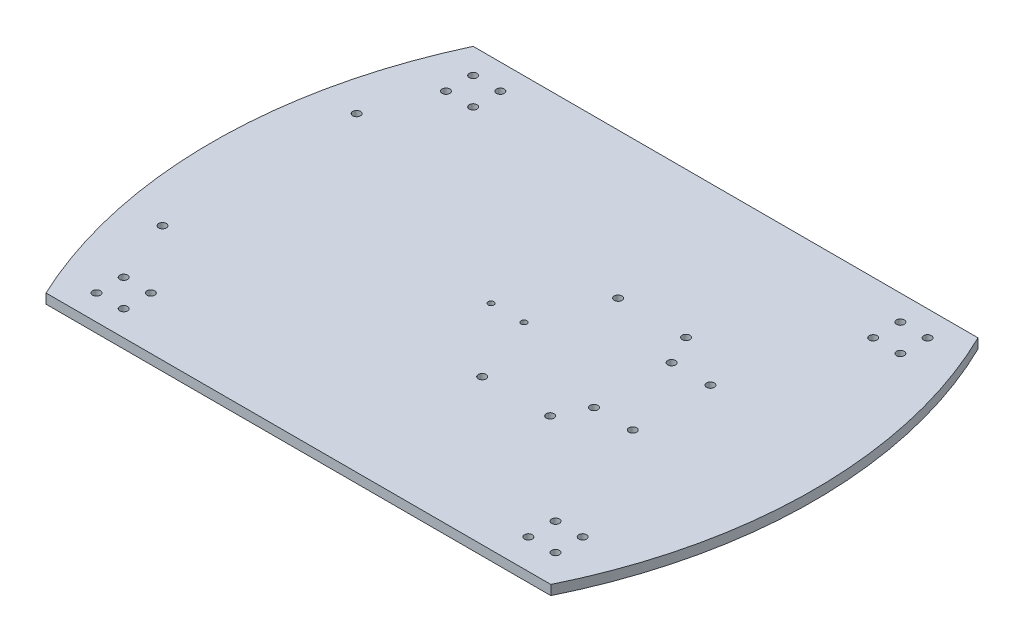
ISO-10303-21;
HEADER;
FILE_DESCRIPTION(('STEP AP214'),'2;1');
FILE_NAME('part.step','',(''),(''),'','','');
FILE_SCHEMA(('AUTOMOTIVE_DESIGN { 1 0 10303 214 1 1 1 1 }'));
ENDSEC;
DATA;
#1=APPLICATION_CONTEXT('core data for automotive mechanical design processes');
#2=APPLICATION_PROTOCOL_DEFINITION('international standard','automotive_design',2000,#1);
#3=PRODUCT_CONTEXT('',#1,'mechanical');
#4=PRODUCT('Part','Part','',(#3));
#5=PRODUCT_RELATED_PRODUCT_CATEGORY('part','',(#4));
#6=PRODUCT_DEFINITION_FORMATION('','',#4);
#7=PRODUCT_DEFINITION_CONTEXT('part definition',#1,'design');
#8=PRODUCT_DEFINITION('design','',#6,#7);
#9=PRODUCT_DEFINITION_SHAPE('','',#8);
#10=(LENGTH_UNIT() NAMED_UNIT(*) SI_UNIT(.MILLI.,.METRE.));
#11=(NAMED_UNIT(*) PLANE_ANGLE_UNIT() SI_UNIT($,.RADIAN.));
#12=(NAMED_UNIT(*) SI_UNIT($,.STERADIAN.) SOLID_ANGLE_UNIT());
#13=UNCERTAINTY_MEASURE_WITH_UNIT(LENGTH_MEASURE(1.E-05),#10,'distance_accuracy_value','');
#14=(GEOMETRIC_REPRESENTATION_CONTEXT(3) GLOBAL_UNCERTAINTY_ASSIGNED_CONTEXT((#13)) GLOBAL_UNIT_ASSIGNED_CONTEXT((#10,
#11,#12)) REPRESENTATION_CONTEXT('',''));
#15=CARTESIAN_POINT('',(0.,0.,0.));
#16=DIRECTION('',(0.,0.,1.));
#17=DIRECTION('',(1.,0.,0.));
#18=AXIS2_PLACEMENT_3D('',#15,#16,#17);
#19=CARTESIAN_POINT('',(0.,5.,-145.));
#20=DIRECTION('',(0.,0.,-1.));
#21=DIRECTION('',(-1.,0.,0.));
#22=AXIS2_PLACEMENT_3D('',#19,#20,#21);
#23=PLANE('',#22);
#24=DIRECTION('',(1.,0.,0.));
#25=VECTOR('',#24,1.);
#26=CARTESIAN_POINT('',(0.,0.,-145.));
#27=LINE('',#26,#25);
#28=CARTESIAN_POINT('',(-131.385271198948,0.,-145.));
#29=VERTEX_POINT('',#28);
#30=CARTESIAN_POINT('',(128.614728801052,0.,-145.));
#31=VERTEX_POINT('',#30);
#32=EDGE_CURVE('E133',#29,#31,#27,.T.);
#33=ORIENTED_EDGE('',*,*,#32,.F.);
#34=DIRECTION('',(0.,-1.,0.));
#35=VECTOR('',#34,1.);
#36=CARTESIAN_POINT('',(-131.385271198948,5.,-145.));
#37=LINE('',#36,#35);
#38=CARTESIAN_POINT('',(-131.385271198948,5.,-145.));
#39=VERTEX_POINT('',#38);
#40=EDGE_CURVE('E11',#39,#29,#37,.T.);
#41=ORIENTED_EDGE('',*,*,#40,.F.);
#42=DIRECTION('',(1.,0.,0.));
#43=VECTOR('',#42,1.);
#44=CARTESIAN_POINT('',(0.,5.,-145.));
#45=LINE('',#44,#43);
#46=CARTESIAN_POINT('',(128.614728801052,5.,-145.));
#47=VERTEX_POINT('',#46);
#48=EDGE_CURVE('E92',#39,#47,#45,.T.);
#49=ORIENTED_EDGE('',*,*,#48,.T.);
#50=DIRECTION('',(0.,-1.,0.));
#51=VECTOR('',#50,1.);
#52=CARTESIAN_POINT('',(128.614728801052,5.,-145.));
#53=LINE('',#52,#51);
#54=EDGE_CURVE('E53',#47,#31,#53,.T.);
#55=ORIENTED_EDGE('',*,*,#54,.T.);
#56=EDGE_LOOP('',(#33,#41,#49,#55));
#57=FACE_BOUND('',#56,.T.);
#58=ADVANCED_FACE('F36',(#57),#23,.T.);
#59=CARTESIAN_POINT('',(103.309394832352,5.,-35.));
#60=DIRECTION('',(0.,-1.,0.));
#61=DIRECTION('',(0.,0.,-1.));
#62=AXIS2_PLACEMENT_3D('',#59,#60,#61);
#63=CYLINDRICAL_SURFACE('',#62,259.194109237736);
#64=CARTESIAN_POINT('',(103.309394832352,0.,-35.));
#65=DIRECTION('',(0.,1.,0.));
#66=DIRECTION('',(0.,0.,1.));
#67=AXIS2_PLACEMENT_3D('',#64,#65,#66);
#68=CIRCLE('',#67,259.194109237736);
#69=CARTESIAN_POINT('',(-131.385271198948,0.,75.));
#70=VERTEX_POINT('',#69);
#71=EDGE_CURVE('E97',#29,#70,#68,.T.);
#72=ORIENTED_EDGE('',*,*,#71,.T.);
#73=DIRECTION('',(0.,-1.,0.));
#74=VECTOR('',#73,1.);
#75=CARTESIAN_POINT('',(-131.385271198948,5.,75.));
#76=LINE('',#75,#74);
#77=CARTESIAN_POINT('',(-131.385271198948,5.,75.));
#78=VERTEX_POINT('',#77);
#79=EDGE_CURVE('E45',#78,#70,#76,.T.);
#80=ORIENTED_EDGE('',*,*,#79,.F.);
#81=CARTESIAN_POINT('',(103.309394832352,5.,-35.));
#82=DIRECTION('',(0.,1.,0.));
#83=DIRECTION('',(0.,0.,1.));
#84=AXIS2_PLACEMENT_3D('',#81,#82,#83);
#85=CIRCLE('',#84,259.194109237736);
#86=EDGE_CURVE('E87',#39,#78,#85,.T.);
#87=ORIENTED_EDGE('',*,*,#86,.F.);
#88=ORIENTED_EDGE('',*,*,#40,.T.);
#89=EDGE_LOOP('',(#72,#80,#87,#88));
#90=FACE_BOUND('',#89,.T.);
#91=ADVANCED_FACE('F95',(#90),#63,.T.);
#92=CARTESIAN_POINT('',(0.,5.,75.));
#93=DIRECTION('',(0.,0.,-1.));
#94=DIRECTION('',(-1.,0.,0.));
#95=AXIS2_PLACEMENT_3D('',#92,#93,#94);
#96=PLANE('',#95);
#97=DIRECTION('',(1.,0.,0.));
#98=VECTOR('',#97,1.);
#99=CARTESIAN_POINT('',(0.,0.,75.));
#100=LINE('',#99,#98);
#101=CARTESIAN_POINT('',(128.614728801052,0.,75.));
#102=VERTEX_POINT('',#101);
#103=EDGE_CURVE('E130',#70,#102,#100,.T.);
#104=ORIENTED_EDGE('',*,*,#103,.T.);
#105=DIRECTION('',(0.,-1.,0.));
#106=VECTOR('',#105,1.);
#107=CARTESIAN_POINT('',(128.614728801052,5.,75.));
#108=LINE('',#107,#106);
#109=CARTESIAN_POINT('',(128.614728801052,5.,75.));
#110=VERTEX_POINT('',#109);
#111=EDGE_CURVE('E67',#110,#102,#108,.T.);
#112=ORIENTED_EDGE('',*,*,#111,.F.);
#113=DIRECTION('',(1.,0.,0.));
#114=VECTOR('',#113,1.);
#115=CARTESIAN_POINT('',(0.,5.,75.));
#116=LINE('',#115,#114);
#117=EDGE_CURVE('E79',#78,#110,#116,.T.);
#118=ORIENTED_EDGE('',*,*,#117,.F.);
#119=ORIENTED_EDGE('',*,*,#79,.T.);
#120=EDGE_LOOP('',(#104,#112,#118,#119));
#121=FACE_BOUND('',#120,.T.);
#122=ADVANCED_FACE('F81',(#121),#96,.F.);
#123=CARTESIAN_POINT('',(101.614728801052,5.,-132.));
#124=DIRECTION('',(0.,-1.,0.));
#125=DIRECTION('',(0.,0.,-1.));
#126=AXIS2_PLACEMENT_3D('',#123,#124,#125);
#127=CYLINDRICAL_SURFACE('',#126,2.);
#128=CARTESIAN_POINT('',(101.614728801052,5.,-132.));
#129=DIRECTION('',(0.,1.,0.));
#130=DIRECTION('',(0.,0.,1.));
#131=AXIS2_PLACEMENT_3D('',#128,#129,#130);
#132=CIRCLE('',#131,2.);
#133=CARTESIAN_POINT('',(101.614728801052,5.,-130.));
#134=VERTEX_POINT('',#133);
#135=EDGE_CURVE('E197',#134,#134,#132,.T.);
#136=ORIENTED_EDGE('',*,*,#135,.T.);
#137=EDGE_LOOP('',(#136));
#138=FACE_BOUND('',#137,.T.);
#139=CARTESIAN_POINT('',(101.614728801052,0.,-132.));
#140=DIRECTION('',(0.,1.,0.));
#141=DIRECTION('',(0.,0.,1.));
#142=AXIS2_PLACEMENT_3D('',#139,#140,#141);
#143=CIRCLE('',#142,2.);
#144=CARTESIAN_POINT('',(101.614728801052,0.,-130.));
#145=VERTEX_POINT('',#144);
#146=EDGE_CURVE('E106',#145,#145,#143,.T.);
#147=ORIENTED_EDGE('',*,*,#146,.F.);
#148=EDGE_LOOP('',(#147));
#149=FACE_BOUND('',#148,.T.);
#150=ADVANCED_FACE('F736',(#138,#149),#127,.F.);
#151=CARTESIAN_POINT('',(101.614728801052,5.,59.5855518026836));
#152=DIRECTION('',(0.,-1.,0.));
#153=DIRECTION('',(0.,0.,-1.));
#154=AXIS2_PLACEMENT_3D('',#151,#152,#153);
#155=CYLINDRICAL_SURFACE('',#154,2.);
#156=CARTESIAN_POINT('',(101.614728801052,5.,59.5855518026836));
#157=DIRECTION('',(0.,1.,0.));
#158=DIRECTION('',(0.,0.,1.));
#159=AXIS2_PLACEMENT_3D('',#156,#157,#158);
#160=CIRCLE('',#159,2.);
#161=CARTESIAN_POINT('',(101.614728801052,5.,61.5855518026836));
#162=VERTEX_POINT('',#161);
#163=EDGE_CURVE('E200',#162,#162,#160,.T.);
#164=ORIENTED_EDGE('',*,*,#163,.T.);
#165=EDGE_LOOP('',(#164));
#166=FACE_BOUND('',#165,.T.);
#167=CARTESIAN_POINT('',(101.614728801052,0.,59.5855518026836));
#168=DIRECTION('',(0.,1.,0.));
#169=DIRECTION('',(0.,0.,1.));
#170=AXIS2_PLACEMENT_3D('',#167,#168,#169);
#171=CIRCLE('',#170,2.);
#172=CARTESIAN_POINT('',(101.614728801052,0.,61.5855518026836));
#173=VERTEX_POINT('',#172);
#174=EDGE_CURVE('E109',#173,#173,#171,.T.);
#175=ORIENTED_EDGE('',*,*,#174,.F.);
#176=EDGE_LOOP('',(#175));
#177=FACE_BOUND('',#176,.T.);
#178=ADVANCED_FACE('F727',(#166,#177),#155,.F.);
#179=CARTESIAN_POINT('',(-118.385271198948,5.,62.));
#180=DIRECTION('',(0.,-1.,0.));
#181=DIRECTION('',(0.,0.,-1.));
#182=AXIS2_PLACEMENT_3D('',#179,#180,#181);
#183=CYLINDRICAL_SURFACE('',#182,2.);
#184=CARTESIAN_POINT('',(-118.385271198948,5.,62.));
#185=DIRECTION('',(0.,1.,0.));
#186=DIRECTION('',(0.,0.,1.));
#187=AXIS2_PLACEMENT_3D('',#184,#185,#186);
#188=CIRCLE('',#187,2.);
#189=CARTESIAN_POINT('',(-118.385271198948,5.,64.));
#190=VERTEX_POINT('',#189);
#191=EDGE_CURVE('E203',#190,#190,#188,.T.);
#192=ORIENTED_EDGE('',*,*,#191,.T.);
#193=EDGE_LOOP('',(#192));
#194=FACE_BOUND('',#193,.T.);
#195=CARTESIAN_POINT('',(-118.385271198948,0.,62.));
#196=DIRECTION('',(0.,1.,0.));
#197=DIRECTION('',(0.,0.,1.));
#198=AXIS2_PLACEMENT_3D('',#195,#196,#197);
#199=CIRCLE('',#198,2.);
#200=CARTESIAN_POINT('',(-118.385271198948,0.,64.));
#201=VERTEX_POINT('',#200);
#202=EDGE_CURVE('E112',#201,#201,#199,.T.);
#203=ORIENTED_EDGE('',*,*,#202,.F.);
#204=EDGE_LOOP('',(#203));
#205=FACE_BOUND('',#204,.T.);
#206=ADVANCED_FACE('F718',(#194,#205),#183,.F.);
#207=CARTESIAN_POINT('',(-12.1932815432223,5.,-35.));
#208=DIRECTION('',(0.,-1.,0.));
#209=DIRECTION('',(0.,0.,-1.));
#210=AXIS2_PLACEMENT_3D('',#207,#208,#209);
#211=CYLINDRICAL_SURFACE('',#210,1.5);
#212=CARTESIAN_POINT('',(-12.1932815432223,5.,-35.));
#213=DIRECTION('',(0.,1.,0.));
#214=DIRECTION('',(0.,0.,1.));
#215=AXIS2_PLACEMENT_3D('',#212,#213,#214);
#216=CIRCLE('',#215,1.5);
#217=CARTESIAN_POINT('',(-12.1932815432223,5.,-33.5));
#218=VERTEX_POINT('',#217);
#219=EDGE_CURVE('E206',#218,#218,#216,.T.);
#220=ORIENTED_EDGE('',*,*,#219,.T.);
#221=EDGE_LOOP('',(#220));
#222=FACE_BOUND('',#221,.T.);
#223=CARTESIAN_POINT('',(-12.1932815432223,0.,-35.));
#224=DIRECTION('',(0.,1.,0.));
#225=DIRECTION('',(0.,0.,1.));
#226=AXIS2_PLACEMENT_3D('',#223,#224,#225);
#227=CIRCLE('',#226,1.5);
#228=CARTESIAN_POINT('',(-12.1932815432223,0.,-33.5));
#229=VERTEX_POINT('',#228);
#230=EDGE_CURVE('E115',#229,#229,#227,.T.);
#231=ORIENTED_EDGE('',*,*,#230,.F.);
#232=EDGE_LOOP('',(#231));
#233=FACE_BOUND('',#232,.T.);
#234=ADVANCED_FACE('F709',(#222,#233),#211,.F.);
#235=CARTESIAN_POINT('',(18.2562657607656,5.,0.));
#236=DIRECTION('',(0.,-1.,0.));
#237=DIRECTION('',(0.,0.,-1.));
#238=AXIS2_PLACEMENT_3D('',#235,#236,#237);
#239=CYLINDRICAL_SURFACE('',#238,2.);
#240=CARTESIAN_POINT('',(18.2562657607656,5.,0.));
#241=DIRECTION('',(0.,1.,0.));
#242=DIRECTION('',(0.,0.,1.));
#243=AXIS2_PLACEMENT_3D('',#240,#241,#242);
#244=CIRCLE('',#243,2.);
#245=CARTESIAN_POINT('',(18.2562657607656,5.,2.00000000000001));
#246=VERTEX_POINT('',#245);
#247=EDGE_CURVE('E209',#246,#246,#244,.T.);
#248=ORIENTED_EDGE('',*,*,#247,.T.);
#249=EDGE_LOOP('',(#248));
#250=FACE_BOUND('',#249,.T.);
#251=CARTESIAN_POINT('',(18.2562657607656,0.,0.));
#252=DIRECTION('',(0.,1.,0.));
#253=DIRECTION('',(0.,0.,1.));
#254=AXIS2_PLACEMENT_3D('',#251,#252,#253);
#255=CIRCLE('',#254,2.);
#256=CARTESIAN_POINT('',(18.2562657607656,0.,2.00000000000001));
#257=VERTEX_POINT('',#256);
#258=EDGE_CURVE('E118',#257,#257,#255,.T.);
#259=ORIENTED_EDGE('',*,*,#258,.F.);
#260=EDGE_LOOP('',(#259));
#261=FACE_BOUND('',#260,.T.);
#262=ADVANCED_FACE('F700',(#250,#261),#239,.F.);
#263=CARTESIAN_POINT('',(60.8158963903236,5.,-15.));
#264=DIRECTION('',(0.,-1.,0.));
#265=DIRECTION('',(0.,0.,-1.));
#266=AXIS2_PLACEMENT_3D('',#263,#264,#265);
#267=CYLINDRICAL_SURFACE('',#266,2.);
#268=CARTESIAN_POINT('',(60.8158963903236,5.,-15.));
#269=DIRECTION('',(0.,1.,0.));
#270=DIRECTION('',(0.,0.,1.));
#271=AXIS2_PLACEMENT_3D('',#268,#269,#270);
#272=CIRCLE('',#271,2.);
#273=CARTESIAN_POINT('',(60.8158963903236,5.,-13.));
#274=VERTEX_POINT('',#273);
#275=EDGE_CURVE('E212',#274,#274,#272,.T.);
#276=ORIENTED_EDGE('',*,*,#275,.T.);
#277=EDGE_LOOP('',(#276));
#278=FACE_BOUND('',#277,.T.);
#279=CARTESIAN_POINT('',(60.8158963903236,0.,-15.));
#280=DIRECTION('',(0.,1.,0.));
#281=DIRECTION('',(0.,0.,1.));
#282=AXIS2_PLACEMENT_3D('',#279,#280,#281);
#283=CIRCLE('',#282,2.);
#284=CARTESIAN_POINT('',(60.8158963903236,0.,-13.));
#285=VERTEX_POINT('',#284);
#286=EDGE_CURVE('E121',#285,#285,#283,.T.);
#287=ORIENTED_EDGE('',*,*,#286,.F.);
#288=EDGE_LOOP('',(#287));
#289=FACE_BOUND('',#288,.T.);
#290=ADVANCED_FACE('F691',(#278,#289),#267,.F.);
#291=CARTESIAN_POINT('',(4.80671845677773,5.,-35.));
#292=DIRECTION('',(0.,-1.,0.));
#293=DIRECTION('',(0.,0.,-1.));
#294=AXIS2_PLACEMENT_3D('',#291,#292,#293);
#295=CYLINDRICAL_SURFACE('',#294,1.5);
#296=CARTESIAN_POINT('',(4.80671845677773,5.,-35.));
#297=DIRECTION('',(0.,1.,0.));
#298=DIRECTION('',(0.,0.,1.));
#299=AXIS2_PLACEMENT_3D('',#296,#297,#298);
#300=CIRCLE('',#299,1.5);
#301=CARTESIAN_POINT('',(4.80671845677773,5.,-33.5));
#302=VERTEX_POINT('',#301);
#303=EDGE_CURVE('E215',#302,#302,#300,.T.);
#304=ORIENTED_EDGE('',*,*,#303,.T.);
#305=EDGE_LOOP('',(#304));
#306=FACE_BOUND('',#305,.T.);
#307=CARTESIAN_POINT('',(4.80671845677773,0.,-35.));
#308=DIRECTION('',(0.,1.,0.));
#309=DIRECTION('',(0.,0.,1.));
#310=AXIS2_PLACEMENT_3D('',#307,#308,#309);
#311=CIRCLE('',#310,1.5);
#312=CARTESIAN_POINT('',(4.80671845677773,0.,-33.5));
#313=VERTEX_POINT('',#312);
#314=EDGE_CURVE('E124',#313,#313,#311,.T.);
#315=ORIENTED_EDGE('',*,*,#314,.F.);
#316=EDGE_LOOP('',(#315));
#317=FACE_BOUND('',#316,.T.);
#318=ADVANCED_FACE('F683',(#306,#317),#295,.F.);
#319=CARTESIAN_POINT('',(-95.8847144053844,5.,-35.));
#320=DIRECTION('',(0.,-1.,0.));
#321=DIRECTION('',(0.,0.,-1.));
#322=AXIS2_PLACEMENT_3D('',#319,#320,#321);
#323=CYLINDRICAL_SURFACE('',#322,250.);
#324=CARTESIAN_POINT('',(-95.8847144053844,0.,-35.));
#325=DIRECTION('',(0.,1.,0.));
#326=DIRECTION('',(0.,0.,1.));
#327=AXIS2_PLACEMENT_3D('',#324,#325,#326);
#328=CIRCLE('',#327,250.);
#329=EDGE_CURVE('E127',#31,#102,#328,.F.);
#330=ORIENTED_EDGE('',*,*,#329,.F.);
#331=ORIENTED_EDGE('',*,*,#54,.F.);
#332=CARTESIAN_POINT('',(-95.8847144053844,5.,-35.));
#333=DIRECTION('',(0.,1.,0.));
#334=DIRECTION('',(0.,0.,1.));
#335=AXIS2_PLACEMENT_3D('',#332,#333,#334);
#336=CIRCLE('',#335,250.);
#337=EDGE_CURVE('E86',#47,#110,#336,.F.);
#338=ORIENTED_EDGE('',*,*,#337,.T.);
#339=ORIENTED_EDGE('',*,*,#111,.T.);
#340=EDGE_LOOP('',(#330,#331,#338,#339));
#341=FACE_BOUND('',#340,.T.);
#342=ADVANCED_FACE('F329',(#341),#323,.T.);
#343=CARTESIAN_POINT('',(-131.385271198948,5.,-85.));
#344=DIRECTION('',(0.,-1.,0.));
#345=DIRECTION('',(0.,0.,-1.));
#346=AXIS2_PLACEMENT_3D('',#343,#344,#345);
#347=CYLINDRICAL_SURFACE('',#346,2.);
#348=CARTESIAN_POINT('',(-131.385271198948,5.,-85.));
#349=DIRECTION('',(0.,1.,0.));
#350=DIRECTION('',(0.,0.,1.));
#351=AXIS2_PLACEMENT_3D('',#348,#349,#350);
#352=CIRCLE('',#351,2.);
#353=CARTESIAN_POINT('',(-131.385271198948,5.,-83.));
#354=VERTEX_POINT('',#353);
#355=EDGE_CURVE('E220',#354,#354,#352,.T.);
#356=ORIENTED_EDGE('',*,*,#355,.T.);
#357=EDGE_LOOP('',(#356));
#358=FACE_BOUND('',#357,.T.);
#359=CARTESIAN_POINT('',(-131.385271198948,0.,-85.));
#360=DIRECTION('',(0.,1.,0.));
#361=DIRECTION('',(0.,0.,1.));
#362=AXIS2_PLACEMENT_3D('',#359,#360,#361);
#363=CIRCLE('',#362,2.);
#364=CARTESIAN_POINT('',(-131.385271198948,0.,-83.));
#365=VERTEX_POINT('',#364);
#366=EDGE_CURVE('E135',#365,#365,#363,.T.);
#367=ORIENTED_EDGE('',*,*,#366,.F.);
#368=EDGE_LOOP('',(#367));
#369=FACE_BOUND('',#368,.T.);
#370=ADVANCED_FACE('F325',(#358,#369),#347,.F.);
#371=CARTESIAN_POINT('',(-131.385271198948,5.,15.));
#372=DIRECTION('',(0.,-1.,0.));
#373=DIRECTION('',(0.,0.,-1.));
#374=AXIS2_PLACEMENT_3D('',#371,#372,#373);
#375=CYLINDRICAL_SURFACE('',#374,2.);
#376=CARTESIAN_POINT('',(-131.385271198948,5.,15.));
#377=DIRECTION('',(0.,1.,0.));
#378=DIRECTION('',(0.,0.,1.));
#379=AXIS2_PLACEMENT_3D('',#376,#377,#378);
#380=CIRCLE('',#379,2.);
#381=CARTESIAN_POINT('',(-131.385271198948,5.,17.));
#382=VERTEX_POINT('',#381);
#383=EDGE_CURVE('E223',#382,#382,#380,.T.);
#384=ORIENTED_EDGE('',*,*,#383,.T.);
#385=EDGE_LOOP('',(#384));
#386=FACE_BOUND('',#385,.T.);
#387=CARTESIAN_POINT('',(-131.385271198948,0.,15.));
#388=DIRECTION('',(0.,1.,0.));
#389=DIRECTION('',(0.,0.,1.));
#390=AXIS2_PLACEMENT_3D('',#387,#388,#389);
#391=CIRCLE('',#390,2.);
#392=CARTESIAN_POINT('',(-131.385271198948,0.,17.));
#393=VERTEX_POINT('',#392);
#394=EDGE_CURVE('E138',#393,#393,#391,.T.);
#395=ORIENTED_EDGE('',*,*,#394,.F.);
#396=EDGE_LOOP('',(#395));
#397=FACE_BOUND('',#396,.T.);
#398=ADVANCED_FACE('F328',(#386,#397),#375,.F.);
#399=CARTESIAN_POINT('',(-118.385271198948,5.,-118.));
#400=DIRECTION('',(0.,-1.,0.));
#401=DIRECTION('',(0.,0.,-1.));
#402=AXIS2_PLACEMENT_3D('',#399,#400,#401);
#403=CYLINDRICAL_SURFACE('',#402,2.);
#404=CARTESIAN_POINT('',(-118.385271198948,5.,-118.));
#405=DIRECTION('',(0.,1.,0.));
#406=DIRECTION('',(0.,0.,1.));
#407=AXIS2_PLACEMENT_3D('',#404,#405,#406);
#408=CIRCLE('',#407,2.);
#409=CARTESIAN_POINT('',(-118.385271198948,5.,-116.));
#410=VERTEX_POINT('',#409);
#411=EDGE_CURVE('E226',#410,#410,#408,.T.);
#412=ORIENTED_EDGE('',*,*,#411,.T.);
#413=EDGE_LOOP('',(#412));
#414=FACE_BOUND('',#413,.T.);
#415=CARTESIAN_POINT('',(-118.385271198948,0.,-118.));
#416=DIRECTION('',(0.,1.,0.));
#417=DIRECTION('',(0.,0.,1.));
#418=AXIS2_PLACEMENT_3D('',#415,#416,#417);
#419=CIRCLE('',#418,2.);
#420=CARTESIAN_POINT('',(-118.385271198948,0.,-116.));
#421=VERTEX_POINT('',#420);
#422=EDGE_CURVE('E141',#421,#421,#419,.T.);
#423=ORIENTED_EDGE('',*,*,#422,.F.);
#424=EDGE_LOOP('',(#423));
#425=FACE_BOUND('',#424,.T.);
#426=ADVANCED_FACE('F372',(#414,#425),#403,.F.);
#427=CARTESIAN_POINT('',(-104.385271198948,5.,-132.));
#428=DIRECTION('',(0.,-1.,0.));
#429=DIRECTION('',(0.,0.,-1.));
#430=AXIS2_PLACEMENT_3D('',#427,#428,#429);
#431=CYLINDRICAL_SURFACE('',#430,2.);
#432=CARTESIAN_POINT('',(-104.385271198948,5.,-132.));
#433=DIRECTION('',(0.,1.,0.));
#434=DIRECTION('',(0.,0.,1.));
#435=AXIS2_PLACEMENT_3D('',#432,#433,#434);
#436=CIRCLE('',#435,2.);
#437=CARTESIAN_POINT('',(-104.385271198948,5.,-130.));
#438=VERTEX_POINT('',#437);
#439=EDGE_CURVE('E229',#438,#438,#436,.T.);
#440=ORIENTED_EDGE('',*,*,#439,.T.);
#441=EDGE_LOOP('',(#440));
#442=FACE_BOUND('',#441,.T.);
#443=CARTESIAN_POINT('',(-104.385271198948,0.,-132.));
#444=DIRECTION('',(0.,1.,0.));
#445=DIRECTION('',(0.,0.,1.));
#446=AXIS2_PLACEMENT_3D('',#443,#444,#445);
#447=CIRCLE('',#446,2.);
#448=CARTESIAN_POINT('',(-104.385271198948,0.,-130.));
#449=VERTEX_POINT('',#448);
#450=EDGE_CURVE('E144',#449,#449,#447,.T.);
#451=ORIENTED_EDGE('',*,*,#450,.F.);
#452=EDGE_LOOP('',(#451));
#453=FACE_BOUND('',#452,.T.);
#454=ADVANCED_FACE('F376',(#442,#453),#431,.F.);
#455=CARTESIAN_POINT('',(-104.385271198948,5.,-118.));
#456=DIRECTION('',(0.,-1.,0.));
#457=DIRECTION('',(0.,0.,-1.));
#458=AXIS2_PLACEMENT_3D('',#455,#456,#457);
#459=CYLINDRICAL_SURFACE('',#458,2.);
#460=CARTESIAN_POINT('',(-104.385271198948,5.,-118.));
#461=DIRECTION('',(0.,1.,0.));
#462=DIRECTION('',(0.,0.,1.));
#463=AXIS2_PLACEMENT_3D('',#460,#461,#462);
#464=CIRCLE('',#463,2.);
#465=CARTESIAN_POINT('',(-104.385271198948,5.,-116.));
#466=VERTEX_POINT('',#465);
#467=EDGE_CURVE('E232',#466,#466,#464,.T.);
#468=ORIENTED_EDGE('',*,*,#467,.T.);
#469=EDGE_LOOP('',(#468));
#470=FACE_BOUND('',#469,.T.);
#471=CARTESIAN_POINT('',(-104.385271198948,0.,-118.));
#472=DIRECTION('',(0.,1.,0.));
#473=DIRECTION('',(0.,0.,1.));
#474=AXIS2_PLACEMENT_3D('',#471,#472,#473);
#475=CIRCLE('',#474,2.);
#476=CARTESIAN_POINT('',(-104.385271198948,0.,-116.));
#477=VERTEX_POINT('',#476);
#478=EDGE_CURVE('E147',#477,#477,#475,.T.);
#479=ORIENTED_EDGE('',*,*,#478,.F.);
#480=EDGE_LOOP('',(#479));
#481=FACE_BOUND('',#480,.T.);
#482=ADVANCED_FACE('F380',(#470,#481),#459,.F.);
#483=CARTESIAN_POINT('',(101.614728801052,5.,-118.));
#484=DIRECTION('',(0.,-1.,0.));
#485=DIRECTION('',(0.,0.,-1.));
#486=AXIS2_PLACEMENT_3D('',#483,#484,#485);
#487=CYLINDRICAL_SURFACE('',#486,2.);
#488=CARTESIAN_POINT('',(101.614728801052,5.,-118.));
#489=DIRECTION('',(0.,1.,0.));
#490=DIRECTION('',(0.,0.,1.));
#491=AXIS2_PLACEMENT_3D('',#488,#489,#490);
#492=CIRCLE('',#491,2.);
#493=CARTESIAN_POINT('',(101.614728801052,5.,-116.));
#494=VERTEX_POINT('',#493);
#495=EDGE_CURVE('E235',#494,#494,#492,.T.);
#496=ORIENTED_EDGE('',*,*,#495,.T.);
#497=EDGE_LOOP('',(#496));
#498=FACE_BOUND('',#497,.T.);
#499=CARTESIAN_POINT('',(101.614728801052,0.,-118.));
#500=DIRECTION('',(0.,1.,0.));
#501=DIRECTION('',(0.,0.,1.));
#502=AXIS2_PLACEMENT_3D('',#499,#500,#501);
#503=CIRCLE('',#502,2.);
#504=CARTESIAN_POINT('',(101.614728801052,0.,-116.));
#505=VERTEX_POINT('',#504);
#506=EDGE_CURVE('E150',#505,#505,#503,.T.);
#507=ORIENTED_EDGE('',*,*,#506,.F.);
#508=EDGE_LOOP('',(#507));
#509=FACE_BOUND('',#508,.T.);
#510=ADVANCED_FACE('F384',(#498,#509),#487,.F.);
#511=CARTESIAN_POINT('',(115.614728801052,5.,-132.));
#512=DIRECTION('',(0.,-1.,0.));
#513=DIRECTION('',(0.,0.,-1.));
#514=AXIS2_PLACEMENT_3D('',#511,#512,#513);
#515=CYLINDRICAL_SURFACE('',#514,2.);
#516=CARTESIAN_POINT('',(115.614728801052,5.,-132.));
#517=DIRECTION('',(0.,1.,0.));
#518=DIRECTION('',(0.,0.,1.));
#519=AXIS2_PLACEMENT_3D('',#516,#517,#518);
#520=CIRCLE('',#519,2.);
#521=CARTESIAN_POINT('',(115.614728801052,5.,-130.));
#522=VERTEX_POINT('',#521);
#523=EDGE_CURVE('E238',#522,#522,#520,.T.);
#524=ORIENTED_EDGE('',*,*,#523,.T.);
#525=EDGE_LOOP('',(#524));
#526=FACE_BOUND('',#525,.T.);
#527=CARTESIAN_POINT('',(115.614728801052,0.,-132.));
#528=DIRECTION('',(0.,1.,0.));
#529=DIRECTION('',(0.,0.,1.));
#530=AXIS2_PLACEMENT_3D('',#527,#528,#529);
#531=CIRCLE('',#530,2.);
#532=CARTESIAN_POINT('',(115.614728801052,0.,-130.));
#533=VERTEX_POINT('',#532);
#534=EDGE_CURVE('E153',#533,#533,#531,.T.);
#535=ORIENTED_EDGE('',*,*,#534,.F.);
#536=EDGE_LOOP('',(#535));
#537=FACE_BOUND('',#536,.T.);
#538=ADVANCED_FACE('F388',(#526,#537),#515,.F.);
#539=CARTESIAN_POINT('',(115.614728801052,5.,-118.));
#540=DIRECTION('',(0.,-1.,0.));
#541=DIRECTION('',(0.,0.,-1.));
#542=AXIS2_PLACEMENT_3D('',#539,#540,#541);
#543=CYLINDRICAL_SURFACE('',#542,2.);
#544=CARTESIAN_POINT('',(115.614728801052,5.,-118.));
#545=DIRECTION('',(0.,1.,0.));
#546=DIRECTION('',(0.,0.,1.));
#547=AXIS2_PLACEMENT_3D('',#544,#545,#546);
#548=CIRCLE('',#547,2.);
#549=CARTESIAN_POINT('',(115.614728801052,5.,-116.));
#550=VERTEX_POINT('',#549);
#551=EDGE_CURVE('E241',#550,#550,#548,.T.);
#552=ORIENTED_EDGE('',*,*,#551,.T.);
#553=EDGE_LOOP('',(#552));
#554=FACE_BOUND('',#553,.T.);
#555=CARTESIAN_POINT('',(115.614728801052,0.,-118.));
#556=DIRECTION('',(0.,1.,0.));
#557=DIRECTION('',(0.,0.,1.));
#558=AXIS2_PLACEMENT_3D('',#555,#556,#557);
#559=CIRCLE('',#558,2.);
#560=CARTESIAN_POINT('',(115.614728801052,0.,-116.));
#561=VERTEX_POINT('',#560);
#562=EDGE_CURVE('E156',#561,#561,#559,.T.);
#563=ORIENTED_EDGE('',*,*,#562,.F.);
#564=EDGE_LOOP('',(#563));
#565=FACE_BOUND('',#564,.T.);
#566=ADVANCED_FACE('F392',(#554,#565),#543,.F.);
#567=CARTESIAN_POINT('',(101.614728801052,5.,45.5855518026836));
#568=DIRECTION('',(0.,-1.,0.));
#569=DIRECTION('',(0.,0.,-1.));
#570=AXIS2_PLACEMENT_3D('',#567,#568,#569);
#571=CYLINDRICAL_SURFACE('',#570,2.);
#572=CARTESIAN_POINT('',(101.614728801052,5.,45.5855518026836));
#573=DIRECTION('',(0.,1.,0.));
#574=DIRECTION('',(0.,0.,1.));
#575=AXIS2_PLACEMENT_3D('',#572,#573,#574);
#576=CIRCLE('',#575,2.);
#577=CARTESIAN_POINT('',(101.614728801052,5.,47.5855518026836));
#578=VERTEX_POINT('',#577);
#579=EDGE_CURVE('E244',#578,#578,#576,.T.);
#580=ORIENTED_EDGE('',*,*,#579,.T.);
#581=EDGE_LOOP('',(#580));
#582=FACE_BOUND('',#581,.T.);
#583=CARTESIAN_POINT('',(101.614728801052,0.,45.5855518026836));
#584=DIRECTION('',(0.,1.,0.));
#585=DIRECTION('',(0.,0.,1.));
#586=AXIS2_PLACEMENT_3D('',#583,#584,#585);
#587=CIRCLE('',#586,2.);
#588=CARTESIAN_POINT('',(101.614728801052,0.,47.5855518026836));
#589=VERTEX_POINT('',#588);
#590=EDGE_CURVE('E159',#589,#589,#587,.T.);
#591=ORIENTED_EDGE('',*,*,#590,.F.);
#592=EDGE_LOOP('',(#591));
#593=FACE_BOUND('',#592,.T.);
#594=ADVANCED_FACE('F396',(#582,#593),#571,.F.);
#595=CARTESIAN_POINT('',(115.614728801052,5.,59.5855518026836));
#596=DIRECTION('',(0.,-1.,0.));
#597=DIRECTION('',(0.,0.,-1.));
#598=AXIS2_PLACEMENT_3D('',#595,#596,#597);
#599=CYLINDRICAL_SURFACE('',#598,2.);
#600=CARTESIAN_POINT('',(115.614728801052,5.,59.5855518026836));
#601=DIRECTION('',(0.,1.,0.));
#602=DIRECTION('',(0.,0.,1.));
#603=AXIS2_PLACEMENT_3D('',#600,#601,#602);
#604=CIRCLE('',#603,2.);
#605=CARTESIAN_POINT('',(115.614728801052,5.,61.5855518026836));
#606=VERTEX_POINT('',#605);
#607=EDGE_CURVE('E247',#606,#606,#604,.T.);
#608=ORIENTED_EDGE('',*,*,#607,.T.);
#609=EDGE_LOOP('',(#608));
#610=FACE_BOUND('',#609,.T.);
#611=CARTESIAN_POINT('',(115.614728801052,0.,59.5855518026836));
#612=DIRECTION('',(0.,1.,0.));
#613=DIRECTION('',(0.,0.,1.));
#614=AXIS2_PLACEMENT_3D('',#611,#612,#613);
#615=CIRCLE('',#614,2.);
#616=CARTESIAN_POINT('',(115.614728801052,0.,61.5855518026836));
#617=VERTEX_POINT('',#616);
#618=EDGE_CURVE('E162',#617,#617,#615,.T.);
#619=ORIENTED_EDGE('',*,*,#618,.F.);
#620=EDGE_LOOP('',(#619));
#621=FACE_BOUND('',#620,.T.);
#622=ADVANCED_FACE('F400',(#610,#621),#599,.F.);
#623=CARTESIAN_POINT('',(115.614728801052,5.,45.5855518026836));
#624=DIRECTION('',(0.,-1.,0.));
#625=DIRECTION('',(0.,0.,-1.));
#626=AXIS2_PLACEMENT_3D('',#623,#624,#625);
#627=CYLINDRICAL_SURFACE('',#626,2.);
#628=CARTESIAN_POINT('',(115.614728801052,5.,45.5855518026836));
#629=DIRECTION('',(0.,1.,0.));
#630=DIRECTION('',(0.,0.,1.));
#631=AXIS2_PLACEMENT_3D('',#628,#629,#630);
#632=CIRCLE('',#631,2.);
#633=CARTESIAN_POINT('',(115.614728801052,5.,47.5855518026836));
#634=VERTEX_POINT('',#633);
#635=EDGE_CURVE('E250',#634,#634,#632,.T.);
#636=ORIENTED_EDGE('',*,*,#635,.T.);
#637=EDGE_LOOP('',(#636));
#638=FACE_BOUND('',#637,.T.);
#639=CARTESIAN_POINT('',(115.614728801052,0.,45.5855518026836));
#640=DIRECTION('',(0.,1.,0.));
#641=DIRECTION('',(0.,0.,1.));
#642=AXIS2_PLACEMENT_3D('',#639,#640,#641);
#643=CIRCLE('',#642,2.);
#644=CARTESIAN_POINT('',(115.614728801052,0.,47.5855518026836));
#645=VERTEX_POINT('',#644);
#646=EDGE_CURVE('E165',#645,#645,#643,.T.);
#647=ORIENTED_EDGE('',*,*,#646,.F.);
#648=EDGE_LOOP('',(#647));
#649=FACE_BOUND('',#648,.T.);
#650=ADVANCED_FACE('F404',(#638,#649),#627,.F.);
#651=CARTESIAN_POINT('',(-104.385271198948,5.,48.));
#652=DIRECTION('',(0.,-1.,0.));
#653=DIRECTION('',(0.,0.,-1.));
#654=AXIS2_PLACEMENT_3D('',#651,#652,#653);
#655=CYLINDRICAL_SURFACE('',#654,2.);
#656=CARTESIAN_POINT('',(-104.385271198948,5.,48.));
#657=DIRECTION('',(0.,1.,0.));
#658=DIRECTION('',(0.,0.,1.));
#659=AXIS2_PLACEMENT_3D('',#656,#657,#658);
#660=CIRCLE('',#659,2.);
#661=CARTESIAN_POINT('',(-104.385271198948,5.,50.));
#662=VERTEX_POINT('',#661);
#663=EDGE_CURVE('E253',#662,#662,#660,.T.);
#664=ORIENTED_EDGE('',*,*,#663,.T.);
#665=EDGE_LOOP('',(#664));
#666=FACE_BOUND('',#665,.T.);
#667=CARTESIAN_POINT('',(-104.385271198948,0.,48.));
#668=DIRECTION('',(0.,1.,0.));
#669=DIRECTION('',(0.,0.,1.));
#670=AXIS2_PLACEMENT_3D('',#667,#668,#669);
#671=CIRCLE('',#670,2.);
#672=CARTESIAN_POINT('',(-104.385271198948,0.,50.));
#673=VERTEX_POINT('',#672);
#674=EDGE_CURVE('E168',#673,#673,#671,.T.);
#675=ORIENTED_EDGE('',*,*,#674,.F.);
#676=EDGE_LOOP('',(#675));
#677=FACE_BOUND('',#676,.T.);
#678=ADVANCED_FACE('F408',(#666,#677),#655,.F.);
#679=CARTESIAN_POINT('',(-118.385271198948,5.,48.));
#680=DIRECTION('',(0.,-1.,0.));
#681=DIRECTION('',(0.,0.,-1.));
#682=AXIS2_PLACEMENT_3D('',#679,#680,#681);
#683=CYLINDRICAL_SURFACE('',#682,2.);
#684=CARTESIAN_POINT('',(-118.385271198948,5.,48.));
#685=DIRECTION('',(0.,1.,0.));
#686=DIRECTION('',(0.,0.,1.));
#687=AXIS2_PLACEMENT_3D('',#684,#685,#686);
#688=CIRCLE('',#687,2.);
#689=CARTESIAN_POINT('',(-118.385271198948,5.,50.));
#690=VERTEX_POINT('',#689);
#691=EDGE_CURVE('E256',#690,#690,#688,.T.);
#692=ORIENTED_EDGE('',*,*,#691,.T.);
#693=EDGE_LOOP('',(#692));
#694=FACE_BOUND('',#693,.T.);
#695=CARTESIAN_POINT('',(-118.385271198948,0.,48.));
#696=DIRECTION('',(0.,1.,0.));
#697=DIRECTION('',(0.,0.,1.));
#698=AXIS2_PLACEMENT_3D('',#695,#696,#697);
#699=CIRCLE('',#698,2.);
#700=CARTESIAN_POINT('',(-118.385271198948,0.,50.));
#701=VERTEX_POINT('',#700);
#702=EDGE_CURVE('E171',#701,#701,#699,.T.);
#703=ORIENTED_EDGE('',*,*,#702,.F.);
#704=EDGE_LOOP('',(#703));
#705=FACE_BOUND('',#704,.T.);
#706=ADVANCED_FACE('F412',(#694,#705),#683,.F.);
#707=CARTESIAN_POINT('',(-104.385271198948,5.,62.));
#708=DIRECTION('',(0.,-1.,0.));
#709=DIRECTION('',(0.,0.,-1.));
#710=AXIS2_PLACEMENT_3D('',#707,#708,#709);
#711=CYLINDRICAL_SURFACE('',#710,2.);
#712=CARTESIAN_POINT('',(-104.385271198948,5.,62.));
#713=DIRECTION('',(0.,1.,0.));
#714=DIRECTION('',(0.,0.,1.));
#715=AXIS2_PLACEMENT_3D('',#712,#713,#714);
#716=CIRCLE('',#715,2.);
#717=CARTESIAN_POINT('',(-104.385271198948,5.,64.));
#718=VERTEX_POINT('',#717);
#719=EDGE_CURVE('E259',#718,#718,#716,.T.);
#720=ORIENTED_EDGE('',*,*,#719,.T.);
#721=EDGE_LOOP('',(#720));
#722=FACE_BOUND('',#721,.T.);
#723=CARTESIAN_POINT('',(-104.385271198948,0.,62.));
#724=DIRECTION('',(0.,1.,0.));
#725=DIRECTION('',(0.,0.,1.));
#726=AXIS2_PLACEMENT_3D('',#723,#724,#725);
#727=CIRCLE('',#726,2.);
#728=CARTESIAN_POINT('',(-104.385271198948,0.,64.));
#729=VERTEX_POINT('',#728);
#730=EDGE_CURVE('E174',#729,#729,#727,.T.);
#731=ORIENTED_EDGE('',*,*,#730,.F.);
#732=EDGE_LOOP('',(#731));
#733=FACE_BOUND('',#732,.T.);
#734=ADVANCED_FACE('F416',(#722,#733),#711,.F.);
#735=CARTESIAN_POINT('',(53.2562657607656,5.,0.));
#736=DIRECTION('',(0.,-1.,0.));
#737=DIRECTION('',(0.,0.,-1.));
#738=AXIS2_PLACEMENT_3D('',#735,#736,#737);
#739=CYLINDRICAL_SURFACE('',#738,2.);
#740=CARTESIAN_POINT('',(53.2562657607656,5.,0.));
#741=DIRECTION('',(0.,1.,0.));
#742=DIRECTION('',(0.,0.,1.));
#743=AXIS2_PLACEMENT_3D('',#740,#741,#742);
#744=CIRCLE('',#743,2.);
#745=CARTESIAN_POINT('',(53.2562657607656,5.,2.));
#746=VERTEX_POINT('',#745);
#747=EDGE_CURVE('E262',#746,#746,#744,.T.);
#748=ORIENTED_EDGE('',*,*,#747,.T.);
#749=EDGE_LOOP('',(#748));
#750=FACE_BOUND('',#749,.T.);
#751=CARTESIAN_POINT('',(53.2562657607656,0.,0.));
#752=DIRECTION('',(0.,1.,0.));
#753=DIRECTION('',(0.,0.,1.));
#754=AXIS2_PLACEMENT_3D('',#751,#752,#753);
#755=CIRCLE('',#754,2.);
#756=CARTESIAN_POINT('',(53.2562657607656,0.,2.));
#757=VERTEX_POINT('',#756);
#758=EDGE_CURVE('E177',#757,#757,#755,.T.);
#759=ORIENTED_EDGE('',*,*,#758,.F.);
#760=EDGE_LOOP('',(#759));
#761=FACE_BOUND('',#760,.T.);
#762=ADVANCED_FACE('F420',(#750,#761),#739,.F.);
#763=CARTESIAN_POINT('',(53.2562657607656,5.,-70.));
#764=DIRECTION('',(0.,-1.,0.));
#765=DIRECTION('',(0.,0.,-1.));
#766=AXIS2_PLACEMENT_3D('',#763,#764,#765);
#767=CYLINDRICAL_SURFACE('',#766,2.);
#768=CARTESIAN_POINT('',(53.2562657607656,5.,-70.));
#769=DIRECTION('',(0.,1.,0.));
#770=DIRECTION('',(0.,0.,1.));
#771=AXIS2_PLACEMENT_3D('',#768,#769,#770);
#772=CIRCLE('',#771,2.);
#773=CARTESIAN_POINT('',(53.2562657607656,5.,-68.));
#774=VERTEX_POINT('',#773);
#775=EDGE_CURVE('E265',#774,#774,#772,.T.);
#776=ORIENTED_EDGE('',*,*,#775,.T.);
#777=EDGE_LOOP('',(#776));
#778=FACE_BOUND('',#777,.T.);
#779=CARTESIAN_POINT('',(53.2562657607656,0.,-70.));
#780=DIRECTION('',(0.,1.,0.));
#781=DIRECTION('',(0.,0.,1.));
#782=AXIS2_PLACEMENT_3D('',#779,#780,#781);
#783=CIRCLE('',#782,2.);
#784=CARTESIAN_POINT('',(53.2562657607656,0.,-68.));
#785=VERTEX_POINT('',#784);
#786=EDGE_CURVE('E180',#785,#785,#783,.T.);
#787=ORIENTED_EDGE('',*,*,#786,.F.);
#788=EDGE_LOOP('',(#787));
#789=FACE_BOUND('',#788,.T.);
#790=ADVANCED_FACE('F424',(#778,#789),#767,.F.);
#791=CARTESIAN_POINT('',(18.2562657607656,5.,-70.));
#792=DIRECTION('',(0.,-1.,0.));
#793=DIRECTION('',(0.,0.,-1.));
#794=AXIS2_PLACEMENT_3D('',#791,#792,#793);
#795=CYLINDRICAL_SURFACE('',#794,2.);
#796=CARTESIAN_POINT('',(18.2562657607656,5.,-70.));
#797=DIRECTION('',(0.,1.,0.));
#798=DIRECTION('',(0.,0.,1.));
#799=AXIS2_PLACEMENT_3D('',#796,#797,#798);
#800=CIRCLE('',#799,2.);
#801=CARTESIAN_POINT('',(18.2562657607656,5.,-68.));
#802=VERTEX_POINT('',#801);
#803=EDGE_CURVE('E268',#802,#802,#800,.T.);
#804=ORIENTED_EDGE('',*,*,#803,.T.);
#805=EDGE_LOOP('',(#804));
#806=FACE_BOUND('',#805,.T.);
#807=CARTESIAN_POINT('',(18.2562657607656,0.,-70.));
#808=DIRECTION('',(0.,1.,0.));
#809=DIRECTION('',(0.,0.,1.));
#810=AXIS2_PLACEMENT_3D('',#807,#808,#809);
#811=CIRCLE('',#810,2.);
#812=CARTESIAN_POINT('',(18.2562657607656,0.,-68.));
#813=VERTEX_POINT('',#812);
#814=EDGE_CURVE('E183',#813,#813,#811,.T.);
#815=ORIENTED_EDGE('',*,*,#814,.F.);
#816=EDGE_LOOP('',(#815));
#817=FACE_BOUND('',#816,.T.);
#818=ADVANCED_FACE('F428',(#806,#817),#795,.F.);
#819=CARTESIAN_POINT('',(80.8158963903236,5.,-15.));
#820=DIRECTION('',(0.,-1.,0.));
#821=DIRECTION('',(0.,0.,-1.));
#822=AXIS2_PLACEMENT_3D('',#819,#820,#821);
#823=CYLINDRICAL_SURFACE('',#822,2.);
#824=CARTESIAN_POINT('',(80.8158963903236,5.,-15.));
#825=DIRECTION('',(0.,1.,0.));
#826=DIRECTION('',(0.,0.,1.));
#827=AXIS2_PLACEMENT_3D('',#824,#825,#826);
#828=CIRCLE('',#827,2.);
#829=CARTESIAN_POINT('',(80.8158963903236,5.,-13.));
#830=VERTEX_POINT('',#829);
#831=EDGE_CURVE('E271',#830,#830,#828,.T.);
#832=ORIENTED_EDGE('',*,*,#831,.T.);
#833=EDGE_LOOP('',(#832));
#834=FACE_BOUND('',#833,.T.);
#835=CARTESIAN_POINT('',(80.8158963903236,0.,-15.));
#836=DIRECTION('',(0.,1.,0.));
#837=DIRECTION('',(0.,0.,1.));
#838=AXIS2_PLACEMENT_3D('',#835,#836,#837);
#839=CIRCLE('',#838,2.);
#840=CARTESIAN_POINT('',(80.8158963903236,0.,-13.));
#841=VERTEX_POINT('',#840);
#842=EDGE_CURVE('E186',#841,#841,#839,.T.);
#843=ORIENTED_EDGE('',*,*,#842,.F.);
#844=EDGE_LOOP('',(#843));
#845=FACE_BOUND('',#844,.T.);
#846=ADVANCED_FACE('F432',(#834,#845),#823,.F.);
#847=CARTESIAN_POINT('',(80.8158963903236,5.,-55.));
#848=DIRECTION('',(0.,-1.,0.));
#849=DIRECTION('',(0.,0.,-1.));
#850=AXIS2_PLACEMENT_3D('',#847,#848,#849);
#851=CYLINDRICAL_SURFACE('',#850,2.);
#852=CARTESIAN_POINT('',(80.8158963903236,5.,-55.));
#853=DIRECTION('',(0.,1.,0.));
#854=DIRECTION('',(0.,0.,1.));
#855=AXIS2_PLACEMENT_3D('',#852,#853,#854);
#856=CIRCLE('',#855,2.);
#857=CARTESIAN_POINT('',(80.8158963903236,5.,-53.));
#858=VERTEX_POINT('',#857);
#859=EDGE_CURVE('E274',#858,#858,#856,.T.);
#860=ORIENTED_EDGE('',*,*,#859,.T.);
#861=EDGE_LOOP('',(#860));
#862=FACE_BOUND('',#861,.T.);
#863=CARTESIAN_POINT('',(80.8158963903236,0.,-55.));
#864=DIRECTION('',(0.,1.,0.));
#865=DIRECTION('',(0.,0.,1.));
#866=AXIS2_PLACEMENT_3D('',#863,#864,#865);
#867=CIRCLE('',#866,2.);
#868=CARTESIAN_POINT('',(80.8158963903236,0.,-53.));
#869=VERTEX_POINT('',#868);
#870=EDGE_CURVE('E189',#869,#869,#867,.T.);
#871=ORIENTED_EDGE('',*,*,#870,.F.);
#872=EDGE_LOOP('',(#871));
#873=FACE_BOUND('',#872,.T.);
#874=ADVANCED_FACE('F360',(#862,#873),#851,.F.);
#875=CARTESIAN_POINT('',(60.8158963903236,5.,-55.));
#876=DIRECTION('',(0.,-1.,0.));
#877=DIRECTION('',(0.,0.,-1.));
#878=AXIS2_PLACEMENT_3D('',#875,#876,#877);
#879=CYLINDRICAL_SURFACE('',#878,2.);
#880=CARTESIAN_POINT('',(60.8158963903236,5.,-55.));
#881=DIRECTION('',(0.,1.,0.));
#882=DIRECTION('',(0.,0.,1.));
#883=AXIS2_PLACEMENT_3D('',#880,#881,#882);
#884=CIRCLE('',#883,2.);
#885=CARTESIAN_POINT('',(60.8158963903236,5.,-53.));
#886=VERTEX_POINT('',#885);
#887=EDGE_CURVE('E105',#886,#886,#884,.T.);
#888=ORIENTED_EDGE('',*,*,#887,.T.);
#889=EDGE_LOOP('',(#888));
#890=FACE_BOUND('',#889,.T.);
#891=CARTESIAN_POINT('',(60.8158963903236,0.,-55.));
#892=DIRECTION('',(0.,1.,0.));
#893=DIRECTION('',(0.,0.,1.));
#894=AXIS2_PLACEMENT_3D('',#891,#892,#893);
#895=CIRCLE('',#894,2.);
#896=CARTESIAN_POINT('',(60.8158963903236,0.,-53.));
#897=VERTEX_POINT('',#896);
#898=EDGE_CURVE('E192',#897,#897,#895,.T.);
#899=ORIENTED_EDGE('',*,*,#898,.F.);
#900=EDGE_LOOP('',(#899));
#901=FACE_BOUND('',#900,.T.);
#902=ADVANCED_FACE('F38',(#890,#901),#879,.F.);
#903=CARTESIAN_POINT('',(-118.385271198948,5.,-132.));
#904=DIRECTION('',(0.,-1.,0.));
#905=DIRECTION('',(0.,0.,-1.));
#906=AXIS2_PLACEMENT_3D('',#903,#904,#905);
#907=CYLINDRICAL_SURFACE('',#906,2.);
#908=CARTESIAN_POINT('',(-118.385271198948,5.,-132.));
#909=DIRECTION('',(0.,1.,0.));
#910=DIRECTION('',(0.,0.,1.));
#911=AXIS2_PLACEMENT_3D('',#908,#909,#910);
#912=CIRCLE('',#911,2.);
#913=CARTESIAN_POINT('',(-118.385271198948,5.,-130.));
#914=VERTEX_POINT('',#913);
#915=EDGE_CURVE('E101',#914,#914,#912,.T.);
#916=ORIENTED_EDGE('',*,*,#915,.T.);
#917=EDGE_LOOP('',(#916));
#918=FACE_BOUND('',#917,.T.);
#919=CARTESIAN_POINT('',(-118.385271198948,0.,-132.));
#920=DIRECTION('',(0.,1.,0.));
#921=DIRECTION('',(0.,0.,1.));
#922=AXIS2_PLACEMENT_3D('',#919,#920,#921);
#923=CIRCLE('',#922,2.);
#924=CARTESIAN_POINT('',(-118.385271198948,0.,-130.));
#925=VERTEX_POINT('',#924);
#926=EDGE_CURVE('E102',#925,#925,#923,.T.);
#927=ORIENTED_EDGE('',*,*,#926,.F.);
#928=EDGE_LOOP('',(#927));
#929=FACE_BOUND('',#928,.T.);
#930=ADVANCED_FACE('F285',(#918,#929),#907,.F.);
#931=CARTESIAN_POINT('',(0.,5.,0.));
#932=DIRECTION('',(0.,1.,0.));
#933=DIRECTION('',(0.,0.,1.));
#934=AXIS2_PLACEMENT_3D('',#931,#932,#933);
#935=PLANE('',#934);
#936=ORIENTED_EDGE('',*,*,#887,.F.);
#937=EDGE_LOOP('',(#936));
#938=FACE_BOUND('',#937,.T.);
#939=ORIENTED_EDGE('',*,*,#859,.F.);
#940=EDGE_LOOP('',(#939));
#941=FACE_BOUND('',#940,.T.);
#942=ORIENTED_EDGE('',*,*,#831,.F.);
#943=EDGE_LOOP('',(#942));
#944=FACE_BOUND('',#943,.T.);
#945=ORIENTED_EDGE('',*,*,#803,.F.);
#946=EDGE_LOOP('',(#945));
#947=FACE_BOUND('',#946,.T.);
#948=ORIENTED_EDGE('',*,*,#775,.F.);
#949=EDGE_LOOP('',(#948));
#950=FACE_BOUND('',#949,.T.);
#951=ORIENTED_EDGE('',*,*,#747,.F.);
#952=EDGE_LOOP('',(#951));
#953=FACE_BOUND('',#952,.T.);
#954=ORIENTED_EDGE('',*,*,#719,.F.);
#955=EDGE_LOOP('',(#954));
#956=FACE_BOUND('',#955,.T.);
#957=ORIENTED_EDGE('',*,*,#691,.F.);
#958=EDGE_LOOP('',(#957));
#959=FACE_BOUND('',#958,.T.);
#960=ORIENTED_EDGE('',*,*,#663,.F.);
#961=EDGE_LOOP('',(#960));
#962=FACE_BOUND('',#961,.T.);
#963=ORIENTED_EDGE('',*,*,#635,.F.);
#964=EDGE_LOOP('',(#963));
#965=FACE_BOUND('',#964,.T.);
#966=ORIENTED_EDGE('',*,*,#607,.F.);
#967=EDGE_LOOP('',(#966));
#968=FACE_BOUND('',#967,.T.);
#969=ORIENTED_EDGE('',*,*,#579,.F.);
#970=EDGE_LOOP('',(#969));
#971=FACE_BOUND('',#970,.T.);
#972=ORIENTED_EDGE('',*,*,#551,.F.);
#973=EDGE_LOOP('',(#972));
#974=FACE_BOUND('',#973,.T.);
#975=ORIENTED_EDGE('',*,*,#523,.F.);
#976=EDGE_LOOP('',(#975));
#977=FACE_BOUND('',#976,.T.);
#978=ORIENTED_EDGE('',*,*,#495,.F.);
#979=EDGE_LOOP('',(#978));
#980=FACE_BOUND('',#979,.T.);
#981=ORIENTED_EDGE('',*,*,#467,.F.);
#982=EDGE_LOOP('',(#981));
#983=FACE_BOUND('',#982,.T.);
#984=ORIENTED_EDGE('',*,*,#439,.F.);
#985=EDGE_LOOP('',(#984));
#986=FACE_BOUND('',#985,.T.);
#987=ORIENTED_EDGE('',*,*,#411,.F.);
#988=EDGE_LOOP('',(#987));
#989=FACE_BOUND('',#988,.T.);
#990=ORIENTED_EDGE('',*,*,#383,.F.);
#991=EDGE_LOOP('',(#990));
#992=FACE_BOUND('',#991,.T.);
#993=ORIENTED_EDGE('',*,*,#355,.F.);
#994=EDGE_LOOP('',(#993));
#995=FACE_BOUND('',#994,.T.);
#996=ORIENTED_EDGE('',*,*,#48,.F.);
#997=ORIENTED_EDGE('',*,*,#86,.T.);
#998=ORIENTED_EDGE('',*,*,#117,.T.);
#999=ORIENTED_EDGE('',*,*,#337,.F.);
#1000=EDGE_LOOP('',(#996,#997,#998,#999));
#1001=FACE_BOUND('',#1000,.T.);
#1002=ORIENTED_EDGE('',*,*,#303,.F.);
#1003=EDGE_LOOP('',(#1002));
#1004=FACE_BOUND('',#1003,.T.);
#1005=ORIENTED_EDGE('',*,*,#275,.F.);
#1006=EDGE_LOOP('',(#1005));
#1007=FACE_BOUND('',#1006,.T.);
#1008=ORIENTED_EDGE('',*,*,#247,.F.);
#1009=EDGE_LOOP('',(#1008));
#1010=FACE_BOUND('',#1009,.T.);
#1011=ORIENTED_EDGE('',*,*,#219,.F.);
#1012=EDGE_LOOP('',(#1011));
#1013=FACE_BOUND('',#1012,.T.);
#1014=ORIENTED_EDGE('',*,*,#191,.F.);
#1015=EDGE_LOOP('',(#1014));
#1016=FACE_BOUND('',#1015,.T.);
#1017=ORIENTED_EDGE('',*,*,#163,.F.);
#1018=EDGE_LOOP('',(#1017));
#1019=FACE_BOUND('',#1018,.T.);
#1020=ORIENTED_EDGE('',*,*,#135,.F.);
#1021=EDGE_LOOP('',(#1020));
#1022=FACE_BOUND('',#1021,.T.);
#1023=ORIENTED_EDGE('',*,*,#915,.F.);
#1024=EDGE_LOOP('',(#1023));
#1025=FACE_BOUND('',#1024,.T.);
#1026=ADVANCED_FACE('F90',(#938,#941,#944,#947,#950,#953,#956,#959,#962,#965,#968,#971,#974,
#977,#980,#983,#986,#989,#992,#995,#1001,#1004,#1007,#1010,#1013,#1016,#1019,#1022,#1025),#935,.T.);
#1027=CARTESIAN_POINT('',(0.,0.,0.));
#1028=DIRECTION('',(0.,1.,0.));
#1029=DIRECTION('',(0.,0.,1.));
#1030=AXIS2_PLACEMENT_3D('',#1027,#1028,#1029);
#1031=PLANE('',#1030);
#1032=ORIENTED_EDGE('',*,*,#898,.T.);
#1033=EDGE_LOOP('',(#1032));
#1034=FACE_BOUND('',#1033,.T.);
#1035=ORIENTED_EDGE('',*,*,#870,.T.);
#1036=EDGE_LOOP('',(#1035));
#1037=FACE_BOUND('',#1036,.T.);
#1038=ORIENTED_EDGE('',*,*,#842,.T.);
#1039=EDGE_LOOP('',(#1038));
#1040=FACE_BOUND('',#1039,.T.);
#1041=ORIENTED_EDGE('',*,*,#814,.T.);
#1042=EDGE_LOOP('',(#1041));
#1043=FACE_BOUND('',#1042,.T.);
#1044=ORIENTED_EDGE('',*,*,#786,.T.);
#1045=EDGE_LOOP('',(#1044));
#1046=FACE_BOUND('',#1045,.T.);
#1047=ORIENTED_EDGE('',*,*,#758,.T.);
#1048=EDGE_LOOP('',(#1047));
#1049=FACE_BOUND('',#1048,.T.);
#1050=ORIENTED_EDGE('',*,*,#730,.T.);
#1051=EDGE_LOOP('',(#1050));
#1052=FACE_BOUND('',#1051,.T.);
#1053=ORIENTED_EDGE('',*,*,#702,.T.);
#1054=EDGE_LOOP('',(#1053));
#1055=FACE_BOUND('',#1054,.T.);
#1056=ORIENTED_EDGE('',*,*,#674,.T.);
#1057=EDGE_LOOP('',(#1056));
#1058=FACE_BOUND('',#1057,.T.);
#1059=ORIENTED_EDGE('',*,*,#646,.T.);
#1060=EDGE_LOOP('',(#1059));
#1061=FACE_BOUND('',#1060,.T.);
#1062=ORIENTED_EDGE('',*,*,#618,.T.);
#1063=EDGE_LOOP('',(#1062));
#1064=FACE_BOUND('',#1063,.T.);
#1065=ORIENTED_EDGE('',*,*,#590,.T.);
#1066=EDGE_LOOP('',(#1065));
#1067=FACE_BOUND('',#1066,.T.);
#1068=ORIENTED_EDGE('',*,*,#562,.T.);
#1069=EDGE_LOOP('',(#1068));
#1070=FACE_BOUND('',#1069,.T.);
#1071=ORIENTED_EDGE('',*,*,#534,.T.);
#1072=EDGE_LOOP('',(#1071));
#1073=FACE_BOUND('',#1072,.T.);
#1074=ORIENTED_EDGE('',*,*,#506,.T.);
#1075=EDGE_LOOP('',(#1074));
#1076=FACE_BOUND('',#1075,.T.);
#1077=ORIENTED_EDGE('',*,*,#478,.T.);
#1078=EDGE_LOOP('',(#1077));
#1079=FACE_BOUND('',#1078,.T.);
#1080=ORIENTED_EDGE('',*,*,#450,.T.);
#1081=EDGE_LOOP('',(#1080));
#1082=FACE_BOUND('',#1081,.T.);
#1083=ORIENTED_EDGE('',*,*,#422,.T.);
#1084=EDGE_LOOP('',(#1083));
#1085=FACE_BOUND('',#1084,.T.);
#1086=ORIENTED_EDGE('',*,*,#394,.T.);
#1087=EDGE_LOOP('',(#1086));
#1088=FACE_BOUND('',#1087,.T.);
#1089=ORIENTED_EDGE('',*,*,#366,.T.);
#1090=EDGE_LOOP('',(#1089));
#1091=FACE_BOUND('',#1090,.T.);
#1092=ORIENTED_EDGE('',*,*,#32,.T.);
#1093=ORIENTED_EDGE('',*,*,#329,.T.);
#1094=ORIENTED_EDGE('',*,*,#103,.F.);
#1095=ORIENTED_EDGE('',*,*,#71,.F.);
#1096=EDGE_LOOP('',(#1092,#1093,#1094,#1095));
#1097=FACE_BOUND('',#1096,.T.);
#1098=ORIENTED_EDGE('',*,*,#314,.T.);
#1099=EDGE_LOOP('',(#1098));
#1100=FACE_BOUND('',#1099,.T.);
#1101=ORIENTED_EDGE('',*,*,#286,.T.);
#1102=EDGE_LOOP('',(#1101));
#1103=FACE_BOUND('',#1102,.T.);
#1104=ORIENTED_EDGE('',*,*,#258,.T.);
#1105=EDGE_LOOP('',(#1104));
#1106=FACE_BOUND('',#1105,.T.);
#1107=ORIENTED_EDGE('',*,*,#230,.T.);
#1108=EDGE_LOOP('',(#1107));
#1109=FACE_BOUND('',#1108,.T.);
#1110=ORIENTED_EDGE('',*,*,#202,.T.);
#1111=EDGE_LOOP('',(#1110));
#1112=FACE_BOUND('',#1111,.T.);
#1113=ORIENTED_EDGE('',*,*,#174,.T.);
#1114=EDGE_LOOP('',(#1113));
#1115=FACE_BOUND('',#1114,.T.);
#1116=ORIENTED_EDGE('',*,*,#146,.T.);
#1117=EDGE_LOOP('',(#1116));
#1118=FACE_BOUND('',#1117,.T.);
#1119=ORIENTED_EDGE('',*,*,#926,.T.);
#1120=EDGE_LOOP('',(#1119));
#1121=FACE_BOUND('',#1120,.T.);
#1122=ADVANCED_FACE('F284',(#1034,#1037,#1040,#1043,#1046,#1049,#1052,#1055,#1058,#1061,#1064,
#1067,#1070,#1073,#1076,#1079,#1082,#1085,#1088,#1091,#1097,#1100,#1103,#1106,#1109,#1112,#1115,
#1118,#1121),#1031,.F.);
#1123=CLOSED_SHELL('',(#58,#91,#122,#150,#178,#206,#234,#262,#290,#318,#342,#370,#398,#426,#454,
#482,#510,#538,#566,#594,#622,#650,#678,#706,#734,#762,#790,#818,#846,#874,#902,#930,#1026,#1122));
#1124=MANIFOLD_SOLID_BREP('B2',#1123);
#1125=ADVANCED_BREP_SHAPE_REPRESENTATION('',(#18,#1124),#14);
#1126=SHAPE_DEFINITION_REPRESENTATION(#9,#1125);
ENDSEC;
END-ISO-10303-21;
